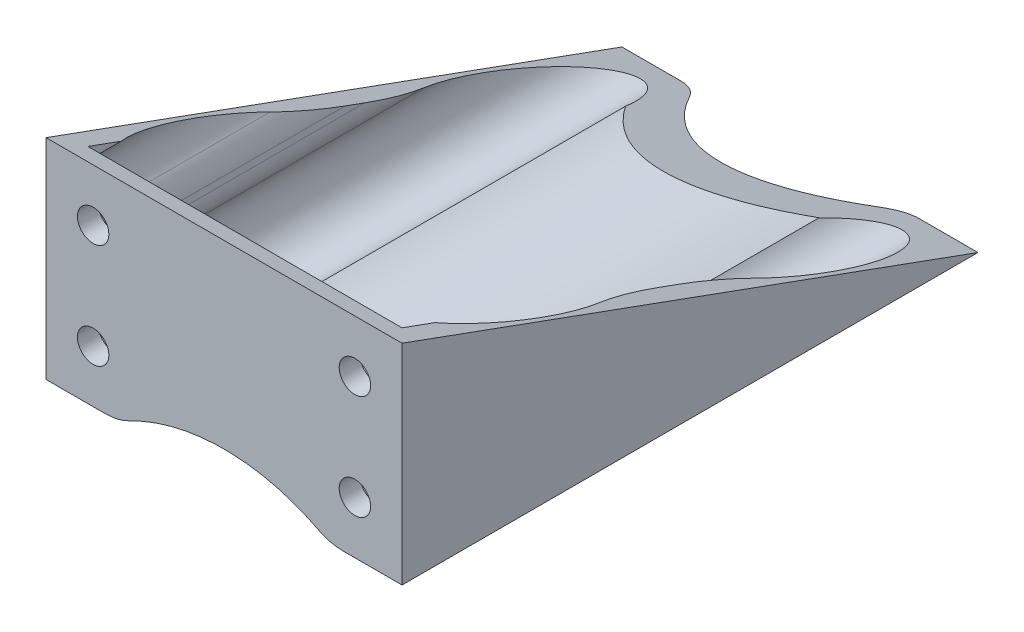
ISO-10303-21;
HEADER;
FILE_DESCRIPTION(('STEP AP214'),'2;1');
FILE_NAME('part.step','',(''),(''),'','','');
FILE_SCHEMA(('AUTOMOTIVE_DESIGN { 1 0 10303 214 1 1 1 1 }'));
ENDSEC;
DATA;
#1=APPLICATION_CONTEXT('core data for automotive mechanical design processes');
#2=APPLICATION_PROTOCOL_DEFINITION('international standard','automotive_design',2000,#1);
#3=PRODUCT_CONTEXT('',#1,'mechanical');
#4=PRODUCT('Part','Part','',(#3));
#5=PRODUCT_RELATED_PRODUCT_CATEGORY('part','',(#4));
#6=PRODUCT_DEFINITION_FORMATION('','',#4);
#7=PRODUCT_DEFINITION_CONTEXT('part definition',#1,'design');
#8=PRODUCT_DEFINITION('design','',#6,#7);
#9=PRODUCT_DEFINITION_SHAPE('','',#8);
#10=(LENGTH_UNIT() NAMED_UNIT(*) SI_UNIT(.MILLI.,.METRE.));
#11=(NAMED_UNIT(*) PLANE_ANGLE_UNIT() SI_UNIT($,.RADIAN.));
#12=(NAMED_UNIT(*) SI_UNIT($,.STERADIAN.) SOLID_ANGLE_UNIT());
#13=UNCERTAINTY_MEASURE_WITH_UNIT(LENGTH_MEASURE(1.E-05),#10,'distance_accuracy_value','');
#14=(GEOMETRIC_REPRESENTATION_CONTEXT(3) GLOBAL_UNCERTAINTY_ASSIGNED_CONTEXT((#13)) GLOBAL_UNIT_ASSIGNED_CONTEXT((#10,
#11,#12)) REPRESENTATION_CONTEXT('',''));
#15=CARTESIAN_POINT('',(0.,0.,0.));
#16=DIRECTION('',(0.,0.,1.));
#17=DIRECTION('',(1.,0.,0.));
#18=AXIS2_PLACEMENT_3D('',#15,#16,#17);
#19=CARTESIAN_POINT('',(32.,0.,0.));
#20=DIRECTION('',(1.,0.,0.));
#21=DIRECTION('',(0.,0.,-1.));
#22=AXIS2_PLACEMENT_3D('',#19,#20,#21);
#23=PLANE('',#22);
#24=DIRECTION('',(0.,0.341743063086704,0.939793423488437));
#25=VECTOR('',#24,1.);
#26=CARTESIAN_POINT('',(32.,0.,-55.));
#27=LINE('',#26,#25);
#28=CARTESIAN_POINT('',(32.,9.66368952654425,-28.4248538020033));
#29=VERTEX_POINT('',#28);
#30=CARTESIAN_POINT('',(32.,10.3363104734556,-26.5751461979971));
#31=VERTEX_POINT('',#30);
#32=EDGE_CURVE('E229',#29,#31,#27,.T.);
#33=ORIENTED_EDGE('',*,*,#32,.F.);
#34=DIRECTION('',(0.,0.,-1.));
#35=VECTOR('',#34,1.);
#36=CARTESIAN_POINT('',(32.,9.66368952654425,-2.));
#37=LINE('',#36,#35);
#38=CARTESIAN_POINT('',(32.,9.66368952654425,-2.));
#39=VERTEX_POINT('',#38);
#40=EDGE_CURVE('E58',#29,#39,#37,.F.);
#41=ORIENTED_EDGE('',*,*,#40,.T.);
#42=DIRECTION('',(0.,-1.,0.));
#43=VECTOR('',#42,1.);
#44=CARTESIAN_POINT('',(32.,20.,-2.));
#45=LINE('',#44,#43);
#46=CARTESIAN_POINT('',(32.,10.3363104734556,-2.));
#47=VERTEX_POINT('',#46);
#48=EDGE_CURVE('E220',#47,#39,#45,.T.);
#49=ORIENTED_EDGE('',*,*,#48,.F.);
#50=DIRECTION('',(0.,0.,-1.));
#51=VECTOR('',#50,1.);
#52=CARTESIAN_POINT('',(32.,10.3363104734556,-22.3368722477978));
#53=LINE('',#52,#51);
#54=EDGE_CURVE('E315',#47,#31,#53,.T.);
#55=ORIENTED_EDGE('',*,*,#54,.T.);
#56=EDGE_LOOP('',(#33,#41,#49,#55));
#57=FACE_BOUND('',#56,.T.);
#58=ADVANCED_FACE('F37',(#57),#23,.F.);
#59=DIRECTION('',(0.,0.,1.));
#60=VECTOR('',#59,1.);
#61=CARTESIAN_POINT('',(32.,18.1224989991992,-55.));
#62=LINE('',#61,#60);
#63=CARTESIAN_POINT('',(32.,18.1224989991992,-2.));
#64=VERTEX_POINT('',#63);
#65=CARTESIAN_POINT('',(32.,18.1224989991992,-5.16312775220221));
#66=VERTEX_POINT('',#65);
#67=EDGE_CURVE('E293',#64,#66,#62,.F.);
#68=ORIENTED_EDGE('',*,*,#67,.F.);
#69=CARTESIAN_POINT('',(32.,19.2727272727273,-2.));
#70=VERTEX_POINT('',#69);
#71=EDGE_CURVE('E217',#70,#64,#45,.T.);
#72=ORIENTED_EDGE('',*,*,#71,.F.);
#73=EDGE_CURVE('E219',#66,#70,#27,.T.);
#74=ORIENTED_EDGE('',*,*,#73,.F.);
#75=EDGE_LOOP('',(#68,#72,#74));
#76=FACE_BOUND('',#75,.T.);
#77=ADVANCED_FACE('F414',(#76),#23,.F.);
#78=CARTESIAN_POINT('',(2.,0.,0.));
#79=DIRECTION('',(1.,0.,0.));
#80=DIRECTION('',(0.,0.,-1.));
#81=AXIS2_PLACEMENT_3D('',#78,#79,#80);
#82=PLANE('',#81);
#83=DIRECTION('',(0.,-1.,0.));
#84=VECTOR('',#83,1.);
#85=CARTESIAN_POINT('',(2.,20.,-2.));
#86=LINE('',#85,#84);
#87=CARTESIAN_POINT('',(2.,10.3363104734556,-2.));
#88=VERTEX_POINT('',#87);
#89=CARTESIAN_POINT('',(2.,9.66368952654456,-2.));
#90=VERTEX_POINT('',#89);
#91=EDGE_CURVE('E204',#88,#90,#86,.T.);
#92=ORIENTED_EDGE('',*,*,#91,.T.);
#93=DIRECTION('',(0.,0.,1.));
#94=VECTOR('',#93,1.);
#95=CARTESIAN_POINT('',(2.,9.66368952654456,0.));
#96=LINE('',#95,#94);
#97=CARTESIAN_POINT('',(2.,9.66368952654456,-28.4248538020024));
#98=VERTEX_POINT('',#97);
#99=EDGE_CURVE('E298',#90,#98,#96,.F.);
#100=ORIENTED_EDGE('',*,*,#99,.T.);
#101=DIRECTION('',(0.,0.341743063086704,0.939793423488437));
#102=VECTOR('',#101,1.);
#103=CARTESIAN_POINT('',(2.,0.,-55.));
#104=LINE('',#103,#102);
#105=CARTESIAN_POINT('',(2.,10.3363104734556,-26.5751461979971));
#106=VERTEX_POINT('',#105);
#107=EDGE_CURVE('E225',#98,#106,#104,.T.);
#108=ORIENTED_EDGE('',*,*,#107,.T.);
#109=DIRECTION('',(0.,0.,1.));
#110=VECTOR('',#109,1.);
#111=CARTESIAN_POINT('',(2.,10.3363104734556,0.));
#112=LINE('',#111,#110);
#113=EDGE_CURVE('E295',#106,#88,#112,.T.);
#114=ORIENTED_EDGE('',*,*,#113,.T.);
#115=EDGE_LOOP('',(#92,#100,#108,#114));
#116=FACE_BOUND('',#115,.T.);
#117=ADVANCED_FACE('F419',(#116),#82,.T.);
#118=CARTESIAN_POINT('',(2.,19.2727272727273,-2.));
#119=VERTEX_POINT('',#118);
#120=CARTESIAN_POINT('',(2.,18.1224989991992,-2.));
#121=VERTEX_POINT('',#120);
#122=EDGE_CURVE('E208',#119,#121,#86,.T.);
#123=ORIENTED_EDGE('',*,*,#122,.T.);
#124=DIRECTION('',(0.,0.,1.));
#125=VECTOR('',#124,1.);
#126=CARTESIAN_POINT('',(2.,18.1224989991992,-55.));
#127=LINE('',#126,#125);
#128=CARTESIAN_POINT('',(2.,18.1224989991992,-5.16312775220218));
#129=VERTEX_POINT('',#128);
#130=EDGE_CURVE('E290',#121,#129,#127,.F.);
#131=ORIENTED_EDGE('',*,*,#130,.T.);
#132=EDGE_CURVE('E223',#129,#119,#104,.T.);
#133=ORIENTED_EDGE('',*,*,#132,.T.);
#134=EDGE_LOOP('',(#123,#131,#133));
#135=FACE_BOUND('',#134,.T.);
#136=ADVANCED_FACE('F426',(#135),#82,.T.);
#137=CARTESIAN_POINT('',(17.,-17.,-55.));
#138=DIRECTION('',(0.,0.,1.));
#139=DIRECTION('',(1.,0.,0.));
#140=AXIS2_PLACEMENT_3D('',#137,#138,#139);
#141=CYLINDRICAL_SURFACE('',#140,21.75);
#142=CARTESIAN_POINT('',(17.,-17.,-2.));
#143=DIRECTION('',(0.,0.,-1.));
#144=DIRECTION('',(-1.,0.,0.));
#145=AXIS2_PLACEMENT_3D('',#142,#143,#144);
#146=CIRCLE('',#145,21.75);
#147=CARTESIAN_POINT('',(26.2319804627916,2.69347700977746,-2.));
#148=VERTEX_POINT('',#147);
#149=CARTESIAN_POINT('',(7.76801953720803,2.6934770097773,-2.));
#150=VERTEX_POINT('',#149);
#151=EDGE_CURVE('E193',#148,#150,#146,.F.);
#152=ORIENTED_EDGE('',*,*,#151,.F.);
#153=DIRECTION('',(0.,0.,1.));
#154=VECTOR('',#153,1.);
#155=CARTESIAN_POINT('',(26.2319804627916,2.69347700977747,-28.5));
#156=LINE('',#155,#154);
#157=CARTESIAN_POINT('',(26.2319804627916,2.69347700977747,-47.592938223112));
#158=VERTEX_POINT('',#157);
#159=EDGE_CURVE('E196',#148,#158,#156,.F.);
#160=ORIENTED_EDGE('',*,*,#159,.T.);
#161=CARTESIAN_POINT('',(17.,-17.,-101.75));
#162=DIRECTION('',(0.,-0.939793423488437,0.341743063086704));
#163=DIRECTION('',(0.,0.341743063086704,0.939793423488437));
#164=AXIS2_PLACEMENT_3D('',#161,#162,#163);
#165=ELLIPSE('',#164,63.644305764538,21.75);
#166=CARTESIAN_POINT('',(7.76801953720805,2.69347700977733,-47.5929382231123));
#167=VERTEX_POINT('',#166);
#168=EDGE_CURVE('E195',#158,#167,#165,.T.);
#169=ORIENTED_EDGE('',*,*,#168,.T.);
#170=DIRECTION('',(0.,0.,1.));
#171=VECTOR('',#170,1.);
#172=CARTESIAN_POINT('',(7.76801953720805,2.69347700977733,-28.5));
#173=LINE('',#172,#171);
#174=EDGE_CURVE('E178',#167,#150,#173,.T.);
#175=ORIENTED_EDGE('',*,*,#174,.T.);
#176=EDGE_LOOP('',(#152,#160,#169,#175));
#177=FACE_BOUND('',#176,.T.);
#178=ADVANCED_FACE('F191',(#177),#141,.T.);
#179=CARTESIAN_POINT('',(34.,0.,-55.));
#180=DIRECTION('',(0.,-0.939793423488437,0.341743063086704));
#181=DIRECTION('',(0.,-0.341743063086704,-0.939793423488437));
#182=AXIS2_PLACEMENT_3D('',#179,#180,#181);
#183=PLANE('',#182);
#184=ORIENTED_EDGE('',*,*,#107,.F.);
#185=CARTESIAN_POINT('',(-2.,9.66368952654456,-28.4248538020025));
#186=DIRECTION('',(0.,-0.939793423488437,0.341743063086704));
#187=DIRECTION('',(0.,0.341743063086704,0.939793423488437));
#188=AXIS2_PLACEMENT_3D('',#185,#186,#187);
#189=ELLIPSE('',#188,11.7046999107196,4.);
#190=CARTESIAN_POINT('',(1.24999999999994,7.33184476327228,-34.8374269010012));
#191=VERTEX_POINT('',#190);
#192=EDGE_CURVE('E307',#98,#191,#189,.F.);
#193=ORIENTED_EDGE('',*,*,#192,.T.);
#194=CARTESIAN_POINT('',(4.49999999999989,5.,-41.25));
#195=DIRECTION('',(0.,-0.939793423488437,0.341743063086704));
#196=DIRECTION('',(0.,0.341743063086704,0.939793423488437));
#197=AXIS2_PLACEMENT_3D('',#194,#195,#196);
#198=ELLIPSE('',#197,11.7046999107196,4.);
#199=EDGE_CURVE('E597',#167,#191,#198,.F.);
#200=ORIENTED_EDGE('',*,*,#199,.F.);
#201=ORIENTED_EDGE('',*,*,#168,.F.);
#202=CARTESIAN_POINT('',(29.4999999999999,5.,-41.25));
#203=DIRECTION('',(0.,-0.939793423488437,0.341743063086704));
#204=DIRECTION('',(0.,0.341743063086704,0.939793423488437));
#205=AXIS2_PLACEMENT_3D('',#202,#203,#204);
#206=ELLIPSE('',#205,11.7046999107196,4.);
#207=CARTESIAN_POINT('',(32.7499999999999,7.33184476327212,-34.8374269010017));
#208=VERTEX_POINT('',#207);
#209=EDGE_CURVE('E337',#208,#158,#206,.F.);
#210=ORIENTED_EDGE('',*,*,#209,.F.);
#211=CARTESIAN_POINT('',(36.,9.66368952654425,-28.4248538020033));
#212=DIRECTION('',(0.,-0.939793423488437,0.341743063086704));
#213=DIRECTION('',(0.,0.341743063086704,0.939793423488437));
#214=AXIS2_PLACEMENT_3D('',#211,#212,#213);
#215=ELLIPSE('',#214,11.7046999107196,4.);
#216=EDGE_CURVE('E303',#208,#29,#215,.F.);
#217=ORIENTED_EDGE('',*,*,#216,.T.);
#218=ORIENTED_EDGE('',*,*,#32,.T.);
#219=CARTESIAN_POINT('',(36.,10.3363104734556,-26.5751461979971));
#220=DIRECTION('',(0.,-0.939793423488437,0.341743063086704));
#221=DIRECTION('',(0.,0.341743063086704,0.939793423488437));
#222=AXIS2_PLACEMENT_3D('',#219,#220,#221);
#223=ELLIPSE('',#222,11.7046999107196,4.);
#224=CARTESIAN_POINT('',(32.75,12.6681552367278,-20.1625730989985));
#225=VERTEX_POINT('',#224);
#226=EDGE_CURVE('E301',#31,#225,#223,.F.);
#227=ORIENTED_EDGE('',*,*,#226,.T.);
#228=CARTESIAN_POINT('',(29.5,15.,-13.75));
#229=DIRECTION('',(0.,-0.939793423488437,0.341743063086704));
#230=DIRECTION('',(0.,0.341743063086704,0.939793423488437));
#231=AXIS2_PLACEMENT_3D('',#228,#229,#230);
#232=ELLIPSE('',#231,11.7046999107196,4.);
#233=EDGE_CURVE('E340',#66,#225,#232,.F.);
#234=ORIENTED_EDGE('',*,*,#233,.F.);
#235=ORIENTED_EDGE('',*,*,#73,.T.);
#236=DIRECTION('',(-1.,0.,0.));
#237=VECTOR('',#236,1.);
#238=CARTESIAN_POINT('',(34.,19.2727272727273,-2.));
#239=LINE('',#238,#237);
#240=EDGE_CURVE('E226',#70,#119,#239,.T.);
#241=ORIENTED_EDGE('',*,*,#240,.T.);
#242=ORIENTED_EDGE('',*,*,#132,.F.);
#243=CARTESIAN_POINT('',(4.49999999999999,15.,-13.75));
#244=DIRECTION('',(0.,-0.939793423488437,0.341743063086704));
#245=DIRECTION('',(0.,0.341743063086704,0.939793423488437));
#246=AXIS2_PLACEMENT_3D('',#243,#244,#245);
#247=ELLIPSE('',#246,11.7046999107196,4.);
#248=CARTESIAN_POINT('',(1.25,12.6681552367278,-20.1625730989986));
#249=VERTEX_POINT('',#248);
#250=EDGE_CURVE('E346',#249,#129,#247,.F.);
#251=ORIENTED_EDGE('',*,*,#250,.F.);
#252=CARTESIAN_POINT('',(-2.,10.3363104734556,-26.5751461979971));
#253=DIRECTION('',(0.,-0.939793423488437,0.341743063086704));
#254=DIRECTION('',(0.,0.341743063086704,0.939793423488437));
#255=AXIS2_PLACEMENT_3D('',#252,#253,#254);
#256=ELLIPSE('',#255,11.7046999107196,4.);
#257=EDGE_CURVE('E305',#249,#106,#256,.F.);
#258=ORIENTED_EDGE('',*,*,#257,.T.);
#259=EDGE_LOOP('',(#184,#193,#200,#201,#210,#217,#218,#227,#234,#235,#241,#242,#251,#258));
#260=FACE_BOUND('',#259,.T.);
#261=CARTESIAN_POINT('',(17.,-17.,-101.75));
#262=DIRECTION('',(0.,-0.939793423488437,0.341743063086704));
#263=DIRECTION('',(0.,0.341743063086704,0.939793423488437));
#264=AXIS2_PLACEMENT_3D('',#261,#262,#263);
#265=ELLIPSE('',#264,57.7919558091781,19.75);
#266=CARTESIAN_POINT('',(26.0479262339943,0.555555555555552,-53.4722222222222));
#267=VERTEX_POINT('',#266);
#268=CARTESIAN_POINT('',(7.95207376600571,0.555555555555556,-53.4722222222222));
#269=VERTEX_POINT('',#268);
#270=EDGE_CURVE('E261',#267,#269,#265,.T.);
#271=ORIENTED_EDGE('',*,*,#270,.T.);
#272=CARTESIAN_POINT('',(5.66145952955145,5.,-41.25));
#273=DIRECTION('',(0.,-0.939793423488437,0.341743063086704));
#274=DIRECTION('',(0.,0.341743063086704,0.939793423488437));
#275=AXIS2_PLACEMENT_3D('',#272,#273,#274);
#276=ELLIPSE('',#275,14.6308748883995,5.);
#277=CARTESIAN_POINT('',(5.66145952955145,0.,-55.));
#278=VERTEX_POINT('',#277);
#279=EDGE_CURVE('E285',#269,#278,#276,.F.);
#280=ORIENTED_EDGE('',*,*,#279,.T.);
#281=DIRECTION('',(-1.,0.,0.));
#282=VECTOR('',#281,1.);
#283=CARTESIAN_POINT('',(34.,0.,-55.));
#284=LINE('',#283,#282);
#285=CARTESIAN_POINT('',(0.,0.,-55.));
#286=VERTEX_POINT('',#285);
#287=EDGE_CURVE('E253',#278,#286,#284,.T.);
#288=ORIENTED_EDGE('',*,*,#287,.T.);
#289=DIRECTION('',(0.,0.341743063086704,0.939793423488437));
#290=VECTOR('',#289,1.);
#291=CARTESIAN_POINT('',(0.,0.,-55.));
#292=LINE('',#291,#290);
#293=CARTESIAN_POINT('',(0.,20.,0.));
#294=VERTEX_POINT('',#293);
#295=EDGE_CURVE('E240',#286,#294,#292,.T.);
#296=ORIENTED_EDGE('',*,*,#295,.T.);
#297=DIRECTION('',(-1.,0.,0.));
#298=VECTOR('',#297,1.);
#299=CARTESIAN_POINT('',(34.,20.,0.));
#300=LINE('',#299,#298);
#301=CARTESIAN_POINT('',(34.,20.,0.));
#302=VERTEX_POINT('',#301);
#303=EDGE_CURVE('E244',#302,#294,#300,.T.);
#304=ORIENTED_EDGE('',*,*,#303,.F.);
#305=DIRECTION('',(0.,0.341743063086704,0.939793423488437));
#306=VECTOR('',#305,1.);
#307=CARTESIAN_POINT('',(34.,0.,-55.));
#308=LINE('',#307,#306);
#309=CARTESIAN_POINT('',(34.,0.,-55.));
#310=VERTEX_POINT('',#309);
#311=EDGE_CURVE('E242',#310,#302,#308,.T.);
#312=ORIENTED_EDGE('',*,*,#311,.F.);
#313=CARTESIAN_POINT('',(28.3385404704486,0.,-55.));
#314=VERTEX_POINT('',#313);
#315=EDGE_CURVE('E254',#310,#314,#284,.T.);
#316=ORIENTED_EDGE('',*,*,#315,.T.);
#317=CARTESIAN_POINT('',(28.3385404704486,5.,-41.25));
#318=DIRECTION('',(0.,-0.939793423488437,0.341743063086704));
#319=DIRECTION('',(0.,0.341743063086704,0.939793423488437));
#320=AXIS2_PLACEMENT_3D('',#317,#318,#319);
#321=ELLIPSE('',#320,14.6308748883995,5.);
#322=EDGE_CURVE('E283',#314,#267,#321,.F.);
#323=ORIENTED_EDGE('',*,*,#322,.T.);
#324=EDGE_LOOP('',(#271,#280,#288,#296,#304,#312,#316,#323));
#325=FACE_BOUND('',#324,.T.);
#326=ADVANCED_FACE('F334',(#260,#325),#183,.F.);
#327=CARTESIAN_POINT('',(34.,0.,0.));
#328=DIRECTION('',(0.,1.,0.));
#329=DIRECTION('',(0.,0.,1.));
#330=AXIS2_PLACEMENT_3D('',#327,#328,#329);
#331=PLANE('',#330);
#332=ORIENTED_EDGE('',*,*,#287,.F.);
#333=DIRECTION('',(0.,0.,1.));
#334=VECTOR('',#333,1.);
#335=CARTESIAN_POINT('',(5.66145952955145,0.,0.));
#336=LINE('',#335,#334);
#337=CARTESIAN_POINT('',(5.66145952955145,0.,0.));
#338=VERTEX_POINT('',#337);
#339=EDGE_CURVE('E264',#278,#338,#336,.T.);
#340=ORIENTED_EDGE('',*,*,#339,.T.);
#341=DIRECTION('',(-1.,0.,0.));
#342=VECTOR('',#341,1.);
#343=CARTESIAN_POINT('',(34.,0.,0.));
#344=LINE('',#343,#342);
#345=CARTESIAN_POINT('',(0.,0.,0.));
#346=VERTEX_POINT('',#345);
#347=EDGE_CURVE('E257',#338,#346,#344,.T.);
#348=ORIENTED_EDGE('',*,*,#347,.T.);
#349=DIRECTION('',(0.,0.,-1.));
#350=VECTOR('',#349,1.);
#351=CARTESIAN_POINT('',(0.,0.,0.));
#352=LINE('',#351,#350);
#353=EDGE_CURVE('E247',#346,#286,#352,.T.);
#354=ORIENTED_EDGE('',*,*,#353,.T.);
#355=EDGE_LOOP('',(#332,#340,#348,#354));
#356=FACE_BOUND('',#355,.T.);
#357=ADVANCED_FACE('F365',(#356),#331,.F.);
#358=CARTESIAN_POINT('',(34.,20.,0.));
#359=DIRECTION('',(0.,0.,-1.));
#360=DIRECTION('',(-1.,0.,0.));
#361=AXIS2_PLACEMENT_3D('',#358,#359,#360);
#362=PLANE('',#361);
#363=CARTESIAN_POINT('',(4.5000000000001,5.,0.));
#364=DIRECTION('',(0.,0.,1.));
#365=DIRECTION('',(1.,0.,0.));
#366=AXIS2_PLACEMENT_3D('',#363,#364,#365);
#367=CIRCLE('',#366,1.5);
#368=CARTESIAN_POINT('',(6.0000000000001,5.,0.));
#369=VERTEX_POINT('',#368);
#370=EDGE_CURVE('E345',#369,#369,#367,.T.);
#371=ORIENTED_EDGE('',*,*,#370,.F.);
#372=EDGE_LOOP('',(#371));
#373=FACE_BOUND('',#372,.T.);
#374=CARTESIAN_POINT('',(29.5000000000001,5.,0.));
#375=DIRECTION('',(0.,0.,1.));
#376=DIRECTION('',(1.,0.,0.));
#377=AXIS2_PLACEMENT_3D('',#374,#375,#376);
#378=CIRCLE('',#377,1.5);
#379=CARTESIAN_POINT('',(31.0000000000001,5.,0.));
#380=VERTEX_POINT('',#379);
#381=EDGE_CURVE('E349',#380,#380,#378,.T.);
#382=ORIENTED_EDGE('',*,*,#381,.F.);
#383=EDGE_LOOP('',(#382));
#384=FACE_BOUND('',#383,.T.);
#385=CARTESIAN_POINT('',(29.5,15.,0.));
#386=DIRECTION('',(0.,0.,1.));
#387=DIRECTION('',(1.,0.,0.));
#388=AXIS2_PLACEMENT_3D('',#385,#386,#387);
#389=CIRCLE('',#388,1.5);
#390=CARTESIAN_POINT('',(31.,15.,0.));
#391=VERTEX_POINT('',#390);
#392=EDGE_CURVE('E353',#391,#391,#389,.T.);
#393=ORIENTED_EDGE('',*,*,#392,.F.);
#394=EDGE_LOOP('',(#393));
#395=FACE_BOUND('',#394,.T.);
#396=CARTESIAN_POINT('',(4.49999999999999,15.,0.));
#397=DIRECTION('',(0.,0.,1.));
#398=DIRECTION('',(1.,0.,0.));
#399=AXIS2_PLACEMENT_3D('',#396,#397,#398);
#400=CIRCLE('',#399,1.5);
#401=CARTESIAN_POINT('',(5.99999999999999,15.,0.));
#402=VERTEX_POINT('',#401);
#403=EDGE_CURVE('E215',#402,#402,#400,.T.);
#404=ORIENTED_EDGE('',*,*,#403,.F.);
#405=EDGE_LOOP('',(#404));
#406=FACE_BOUND('',#405,.T.);
#407=ORIENTED_EDGE('',*,*,#347,.F.);
#408=CARTESIAN_POINT('',(5.66145952955145,5.,0.));
#409=DIRECTION('',(0.,0.,-1.));
#410=DIRECTION('',(-1.,0.,0.));
#411=AXIS2_PLACEMENT_3D('',#408,#409,#410);
#412=CIRCLE('',#411,5.);
#413=CARTESIAN_POINT('',(7.9520737660057,0.555555555555556,0.));
#414=VERTEX_POINT('',#413);
#415=EDGE_CURVE('E277',#338,#414,#412,.F.);
#416=ORIENTED_EDGE('',*,*,#415,.T.);
#417=CARTESIAN_POINT('',(17.,-17.,0.));
#418=DIRECTION('',(0.,0.,1.));
#419=DIRECTION('',(1.,0.,0.));
#420=AXIS2_PLACEMENT_3D('',#417,#418,#419);
#421=CIRCLE('',#420,19.75);
#422=CARTESIAN_POINT('',(26.0479262339943,0.555555555555556,0.));
#423=VERTEX_POINT('',#422);
#424=EDGE_CURVE('E232',#423,#414,#421,.T.);
#425=ORIENTED_EDGE('',*,*,#424,.F.);
#426=CARTESIAN_POINT('',(28.3385404704486,5.,0.));
#427=DIRECTION('',(0.,0.,-1.));
#428=DIRECTION('',(-1.,0.,0.));
#429=AXIS2_PLACEMENT_3D('',#426,#427,#428);
#430=CIRCLE('',#429,5.);
#431=CARTESIAN_POINT('',(28.3385404704486,0.,0.));
#432=VERTEX_POINT('',#431);
#433=EDGE_CURVE('E275',#423,#432,#430,.F.);
#434=ORIENTED_EDGE('',*,*,#433,.T.);
#435=CARTESIAN_POINT('',(34.,0.,0.));
#436=VERTEX_POINT('',#435);
#437=EDGE_CURVE('E258',#436,#432,#344,.T.);
#438=ORIENTED_EDGE('',*,*,#437,.F.);
#439=DIRECTION('',(0.,-1.,0.));
#440=VECTOR('',#439,1.);
#441=CARTESIAN_POINT('',(34.,20.,0.));
#442=LINE('',#441,#440);
#443=EDGE_CURVE('E236',#302,#436,#442,.T.);
#444=ORIENTED_EDGE('',*,*,#443,.F.);
#445=ORIENTED_EDGE('',*,*,#303,.T.);
#446=DIRECTION('',(0.,-1.,0.));
#447=VECTOR('',#446,1.);
#448=CARTESIAN_POINT('',(0.,20.,0.));
#449=LINE('',#448,#447);
#450=EDGE_CURVE('E235',#294,#346,#449,.T.);
#451=ORIENTED_EDGE('',*,*,#450,.T.);
#452=EDGE_LOOP('',(#407,#416,#425,#434,#438,#444,#445,#451));
#453=FACE_BOUND('',#452,.T.);
#454=ADVANCED_FACE('F361',(#373,#384,#395,#406,#453),#362,.F.);
#455=ORIENTED_EDGE('',*,*,#437,.T.);
#456=DIRECTION('',(0.,0.,1.));
#457=VECTOR('',#456,1.);
#458=CARTESIAN_POINT('',(28.3385404704486,0.,0.));
#459=LINE('',#458,#457);
#460=EDGE_CURVE('E197',#432,#314,#459,.F.);
#461=ORIENTED_EDGE('',*,*,#460,.T.);
#462=ORIENTED_EDGE('',*,*,#315,.F.);
#463=DIRECTION('',(0.,0.,-1.));
#464=VECTOR('',#463,1.);
#465=CARTESIAN_POINT('',(34.,0.,0.));
#466=LINE('',#465,#464);
#467=EDGE_CURVE('E239',#436,#310,#466,.T.);
#468=ORIENTED_EDGE('',*,*,#467,.F.);
#469=EDGE_LOOP('',(#455,#461,#462,#468));
#470=FACE_BOUND('',#469,.T.);
#471=ADVANCED_FACE('F364',(#470),#331,.F.);
#472=CARTESIAN_POINT('',(34.,0.,0.));
#473=DIRECTION('',(1.,0.,0.));
#474=DIRECTION('',(0.,0.,-1.));
#475=AXIS2_PLACEMENT_3D('',#472,#473,#474);
#476=PLANE('',#475);
#477=ORIENTED_EDGE('',*,*,#443,.T.);
#478=ORIENTED_EDGE('',*,*,#467,.T.);
#479=ORIENTED_EDGE('',*,*,#311,.T.);
#480=EDGE_LOOP('',(#477,#478,#479));
#481=FACE_BOUND('',#480,.T.);
#482=ADVANCED_FACE('F388',(#481),#476,.T.);
#483=CARTESIAN_POINT('',(0.,0.,0.));
#484=DIRECTION('',(1.,0.,0.));
#485=DIRECTION('',(0.,0.,-1.));
#486=AXIS2_PLACEMENT_3D('',#483,#484,#485);
#487=PLANE('',#486);
#488=ORIENTED_EDGE('',*,*,#450,.F.);
#489=ORIENTED_EDGE('',*,*,#295,.F.);
#490=ORIENTED_EDGE('',*,*,#353,.F.);
#491=EDGE_LOOP('',(#488,#489,#490));
#492=FACE_BOUND('',#491,.T.);
#493=ADVANCED_FACE('F382',(#492),#487,.F.);
#494=CARTESIAN_POINT('',(17.,-17.,-55.));
#495=DIRECTION('',(0.,0.,1.));
#496=DIRECTION('',(1.,0.,0.));
#497=AXIS2_PLACEMENT_3D('',#494,#495,#496);
#498=CYLINDRICAL_SURFACE('',#497,19.75);
#499=ORIENTED_EDGE('',*,*,#424,.T.);
#500=DIRECTION('',(0.,0.,1.));
#501=VECTOR('',#500,1.);
#502=CARTESIAN_POINT('',(7.9520737660057,0.555555555555559,-55.));
#503=LINE('',#502,#501);
#504=EDGE_CURVE('E281',#414,#269,#503,.F.);
#505=ORIENTED_EDGE('',*,*,#504,.T.);
#506=ORIENTED_EDGE('',*,*,#270,.F.);
#507=DIRECTION('',(0.,0.,1.));
#508=VECTOR('',#507,1.);
#509=CARTESIAN_POINT('',(26.0479262339943,0.555555555555559,-55.));
#510=LINE('',#509,#508);
#511=EDGE_CURVE('E279',#267,#423,#510,.T.);
#512=ORIENTED_EDGE('',*,*,#511,.T.);
#513=EDGE_LOOP('',(#499,#505,#506,#512));
#514=FACE_BOUND('',#513,.T.);
#515=ADVANCED_FACE('F398',(#514),#498,.F.);
#516=CARTESIAN_POINT('',(34.,20.,-2.));
#517=DIRECTION('',(0.,0.,-1.));
#518=DIRECTION('',(-1.,0.,0.));
#519=AXIS2_PLACEMENT_3D('',#516,#517,#518);
#520=PLANE('',#519);
#521=CARTESIAN_POINT('',(29.5,15.,-2.));
#522=DIRECTION('',(0.,0.,-1.));
#523=DIRECTION('',(-1.,0.,0.));
#524=AXIS2_PLACEMENT_3D('',#521,#522,#523);
#525=CIRCLE('',#524,4.);
#526=CARTESIAN_POINT('',(32.75,12.6681552367278,-2.));
#527=VERTEX_POINT('',#526);
#528=EDGE_CURVE('E598',#64,#527,#525,.T.);
#529=ORIENTED_EDGE('',*,*,#528,.T.);
#530=CARTESIAN_POINT('',(36.,10.3363104734556,-2.));
#531=DIRECTION('',(0.,0.,-1.));
#532=DIRECTION('',(-1.,0.,0.));
#533=AXIS2_PLACEMENT_3D('',#530,#531,#532);
#534=CIRCLE('',#533,4.);
#535=EDGE_CURVE('E11',#527,#47,#534,.F.);
#536=ORIENTED_EDGE('',*,*,#535,.T.);
#537=ORIENTED_EDGE('',*,*,#48,.T.);
#538=CARTESIAN_POINT('',(36.,9.66368952654425,-2.));
#539=DIRECTION('',(0.,0.,-1.));
#540=DIRECTION('',(-1.,0.,0.));
#541=AXIS2_PLACEMENT_3D('',#538,#539,#540);
#542=CIRCLE('',#541,4.);
#543=CARTESIAN_POINT('',(32.7499999999999,7.33184476327213,-2.));
#544=VERTEX_POINT('',#543);
#545=EDGE_CURVE('E45',#39,#544,#542,.F.);
#546=ORIENTED_EDGE('',*,*,#545,.T.);
#547=CARTESIAN_POINT('',(29.4999999999999,5.,-2.));
#548=DIRECTION('',(0.,0.,-1.));
#549=DIRECTION('',(-1.,0.,0.));
#550=AXIS2_PLACEMENT_3D('',#547,#548,#549);
#551=CIRCLE('',#550,4.);
#552=EDGE_CURVE('E186',#544,#148,#551,.T.);
#553=ORIENTED_EDGE('',*,*,#552,.T.);
#554=ORIENTED_EDGE('',*,*,#151,.T.);
#555=CARTESIAN_POINT('',(4.49999999999989,5.,-2.));
#556=DIRECTION('',(0.,0.,-1.));
#557=DIRECTION('',(-1.,0.,0.));
#558=AXIS2_PLACEMENT_3D('',#555,#556,#557);
#559=CIRCLE('',#558,4.);
#560=CARTESIAN_POINT('',(1.24999999999994,7.33184476327228,-2.));
#561=VERTEX_POINT('',#560);
#562=EDGE_CURVE('E174',#150,#561,#559,.T.);
#563=ORIENTED_EDGE('',*,*,#562,.T.);
#564=CARTESIAN_POINT('',(-2.,9.66368952654456,-2.));
#565=DIRECTION('',(0.,0.,-1.));
#566=DIRECTION('',(-1.,0.,0.));
#567=AXIS2_PLACEMENT_3D('',#564,#565,#566);
#568=CIRCLE('',#567,4.);
#569=EDGE_CURVE('E320',#561,#90,#568,.F.);
#570=ORIENTED_EDGE('',*,*,#569,.T.);
#571=ORIENTED_EDGE('',*,*,#91,.F.);
#572=CARTESIAN_POINT('',(-2.,10.3363104734556,-2.));
#573=DIRECTION('',(0.,0.,-1.));
#574=DIRECTION('',(-1.,0.,0.));
#575=AXIS2_PLACEMENT_3D('',#572,#573,#574);
#576=CIRCLE('',#575,4.);
#577=CARTESIAN_POINT('',(1.25,12.6681552367278,-2.));
#578=VERTEX_POINT('',#577);
#579=EDGE_CURVE('E322',#88,#578,#576,.F.);
#580=ORIENTED_EDGE('',*,*,#579,.T.);
#581=CARTESIAN_POINT('',(4.49999999999999,15.,-2.));
#582=DIRECTION('',(0.,0.,-1.));
#583=DIRECTION('',(-1.,0.,0.));
#584=AXIS2_PLACEMENT_3D('',#581,#582,#583);
#585=CIRCLE('',#584,4.);
#586=EDGE_CURVE('E185',#578,#121,#585,.T.);
#587=ORIENTED_EDGE('',*,*,#586,.T.);
#588=ORIENTED_EDGE('',*,*,#122,.F.);
#589=ORIENTED_EDGE('',*,*,#240,.F.);
#590=ORIENTED_EDGE('',*,*,#71,.T.);
#591=EDGE_LOOP('',(#529,#536,#537,#546,#553,#554,#563,#570,#571,#580,#587,#588,#589,#590));
#592=FACE_BOUND('',#591,.T.);
#593=CARTESIAN_POINT('',(29.5,15.,-2.));
#594=DIRECTION('',(0.,0.,-1.));
#595=DIRECTION('',(-1.,0.,0.));
#596=AXIS2_PLACEMENT_3D('',#593,#594,#595);
#597=CIRCLE('',#596,1.5);
#598=CARTESIAN_POINT('',(28.,15.,-2.));
#599=VERTEX_POINT('',#598);
#600=EDGE_CURVE('E268',#599,#599,#597,.T.);
#601=ORIENTED_EDGE('',*,*,#600,.F.);
#602=EDGE_LOOP('',(#601));
#603=FACE_BOUND('',#602,.T.);
#604=CARTESIAN_POINT('',(4.49999999999999,15.,-2.));
#605=DIRECTION('',(0.,0.,-1.));
#606=DIRECTION('',(-1.,0.,0.));
#607=AXIS2_PLACEMENT_3D('',#604,#605,#606);
#608=CIRCLE('',#607,1.5);
#609=CARTESIAN_POINT('',(2.99999999999999,15.,-2.));
#610=VERTEX_POINT('',#609);
#611=EDGE_CURVE('E265',#610,#610,#608,.T.);
#612=ORIENTED_EDGE('',*,*,#611,.F.);
#613=EDGE_LOOP('',(#612));
#614=FACE_BOUND('',#613,.T.);
#615=CARTESIAN_POINT('',(4.5000000000001,5.,-2.));
#616=DIRECTION('',(0.,0.,-1.));
#617=DIRECTION('',(-1.,0.,0.));
#618=AXIS2_PLACEMENT_3D('',#615,#616,#617);
#619=CIRCLE('',#618,1.5);
#620=CARTESIAN_POINT('',(3.0000000000001,5.,-2.));
#621=VERTEX_POINT('',#620);
#622=EDGE_CURVE('E205',#621,#621,#619,.T.);
#623=ORIENTED_EDGE('',*,*,#622,.F.);
#624=EDGE_LOOP('',(#623));
#625=FACE_BOUND('',#624,.T.);
#626=CARTESIAN_POINT('',(29.5000000000001,5.,-2.));
#627=DIRECTION('',(0.,0.,-1.));
#628=DIRECTION('',(-1.,0.,0.));
#629=AXIS2_PLACEMENT_3D('',#626,#627,#628);
#630=CIRCLE('',#629,1.5);
#631=CARTESIAN_POINT('',(28.0000000000001,5.,-2.));
#632=VERTEX_POINT('',#631);
#633=EDGE_CURVE('E211',#632,#632,#630,.T.);
#634=ORIENTED_EDGE('',*,*,#633,.F.);
#635=EDGE_LOOP('',(#634));
#636=FACE_BOUND('',#635,.T.);
#637=ADVANCED_FACE('F200',(#592,#603,#614,#625,#636),#520,.T.);
#638=CARTESIAN_POINT('',(4.49999999999999,15.,-10.));
#639=DIRECTION('',(0.,0.,1.));
#640=DIRECTION('',(1.,0.,0.));
#641=AXIS2_PLACEMENT_3D('',#638,#639,#640);
#642=CYLINDRICAL_SURFACE('',#641,1.5);
#643=ORIENTED_EDGE('',*,*,#611,.T.);
#644=EDGE_LOOP('',(#643));
#645=FACE_BOUND('',#644,.T.);
#646=ORIENTED_EDGE('',*,*,#403,.T.);
#647=EDGE_LOOP('',(#646));
#648=FACE_BOUND('',#647,.T.);
#649=ADVANCED_FACE('F518',(#645,#648),#642,.F.);
#650=CARTESIAN_POINT('',(29.5,15.,-10.));
#651=DIRECTION('',(0.,0.,1.));
#652=DIRECTION('',(1.,0.,0.));
#653=AXIS2_PLACEMENT_3D('',#650,#651,#652);
#654=CYLINDRICAL_SURFACE('',#653,1.5);
#655=ORIENTED_EDGE('',*,*,#600,.T.);
#656=EDGE_LOOP('',(#655));
#657=FACE_BOUND('',#656,.T.);
#658=ORIENTED_EDGE('',*,*,#392,.T.);
#659=EDGE_LOOP('',(#658));
#660=FACE_BOUND('',#659,.T.);
#661=ADVANCED_FACE('F608',(#657,#660),#654,.F.);
#662=CARTESIAN_POINT('',(29.5000000000001,5.,-10.));
#663=DIRECTION('',(0.,0.,1.));
#664=DIRECTION('',(1.,0.,0.));
#665=AXIS2_PLACEMENT_3D('',#662,#663,#664);
#666=CYLINDRICAL_SURFACE('',#665,1.5);
#667=ORIENTED_EDGE('',*,*,#633,.T.);
#668=EDGE_LOOP('',(#667));
#669=FACE_BOUND('',#668,.T.);
#670=ORIENTED_EDGE('',*,*,#381,.T.);
#671=EDGE_LOOP('',(#670));
#672=FACE_BOUND('',#671,.T.);
#673=ADVANCED_FACE('F359',(#669,#672),#666,.F.);
#674=CARTESIAN_POINT('',(4.5000000000001,5.,-10.));
#675=DIRECTION('',(0.,0.,1.));
#676=DIRECTION('',(1.,0.,0.));
#677=AXIS2_PLACEMENT_3D('',#674,#675,#676);
#678=CYLINDRICAL_SURFACE('',#677,1.5);
#679=ORIENTED_EDGE('',*,*,#622,.T.);
#680=EDGE_LOOP('',(#679));
#681=FACE_BOUND('',#680,.T.);
#682=ORIENTED_EDGE('',*,*,#370,.T.);
#683=EDGE_LOOP('',(#682));
#684=FACE_BOUND('',#683,.T.);
#685=ADVANCED_FACE('F404',(#681,#684),#678,.F.);
#686=CARTESIAN_POINT('',(5.66145952955145,5.,-55.));
#687=DIRECTION('',(0.,0.,1.));
#688=DIRECTION('',(1.,0.,0.));
#689=AXIS2_PLACEMENT_3D('',#686,#687,#688);
#690=CYLINDRICAL_SURFACE('',#689,5.);
#691=ORIENTED_EDGE('',*,*,#279,.F.);
#692=ORIENTED_EDGE('',*,*,#504,.F.);
#693=ORIENTED_EDGE('',*,*,#415,.F.);
#694=ORIENTED_EDGE('',*,*,#339,.F.);
#695=EDGE_LOOP('',(#691,#692,#693,#694));
#696=FACE_BOUND('',#695,.T.);
#697=ADVANCED_FACE('F402',(#696),#690,.T.);
#698=CARTESIAN_POINT('',(28.3385404704486,5.,-55.));
#699=DIRECTION('',(0.,0.,1.));
#700=DIRECTION('',(1.,0.,0.));
#701=AXIS2_PLACEMENT_3D('',#698,#699,#700);
#702=CYLINDRICAL_SURFACE('',#701,5.);
#703=ORIENTED_EDGE('',*,*,#433,.F.);
#704=ORIENTED_EDGE('',*,*,#511,.F.);
#705=ORIENTED_EDGE('',*,*,#322,.F.);
#706=ORIENTED_EDGE('',*,*,#460,.F.);
#707=EDGE_LOOP('',(#703,#704,#705,#706));
#708=FACE_BOUND('',#707,.T.);
#709=ADVANCED_FACE('F395',(#708),#702,.T.);
#710=CARTESIAN_POINT('',(4.49999999999989,5.,-55.));
#711=DIRECTION('',(0.,0.,1.));
#712=DIRECTION('',(1.,0.,0.));
#713=AXIS2_PLACEMENT_3D('',#710,#711,#712);
#714=CYLINDRICAL_SURFACE('',#713,4.);
#715=ORIENTED_EDGE('',*,*,#199,.T.);
#716=DIRECTION('',(0.,0.,1.));
#717=VECTOR('',#716,1.);
#718=CARTESIAN_POINT('',(1.24999999999994,7.33184476327228,-55.));
#719=LINE('',#718,#717);
#720=EDGE_CURVE('E181',#191,#561,#719,.T.);
#721=ORIENTED_EDGE('',*,*,#720,.T.);
#722=ORIENTED_EDGE('',*,*,#562,.F.);
#723=ORIENTED_EDGE('',*,*,#174,.F.);
#724=EDGE_LOOP('',(#715,#721,#722,#723));
#725=FACE_BOUND('',#724,.T.);
#726=ADVANCED_FACE('F177',(#725),#714,.F.);
#727=CARTESIAN_POINT('',(29.4999999999999,5.,-55.));
#728=DIRECTION('',(0.,0.,1.));
#729=DIRECTION('',(1.,0.,0.));
#730=AXIS2_PLACEMENT_3D('',#727,#728,#729);
#731=CYLINDRICAL_SURFACE('',#730,4.);
#732=ORIENTED_EDGE('',*,*,#552,.F.);
#733=DIRECTION('',(0.,0.,1.));
#734=VECTOR('',#733,1.);
#735=CARTESIAN_POINT('',(32.7499999999999,7.33184476327212,-55.));
#736=LINE('',#735,#734);
#737=EDGE_CURVE('E312',#544,#208,#736,.F.);
#738=ORIENTED_EDGE('',*,*,#737,.T.);
#739=ORIENTED_EDGE('',*,*,#209,.T.);
#740=ORIENTED_EDGE('',*,*,#159,.F.);
#741=EDGE_LOOP('',(#732,#738,#739,#740));
#742=FACE_BOUND('',#741,.T.);
#743=ADVANCED_FACE('F327',(#742),#731,.F.);
#744=CARTESIAN_POINT('',(4.49999999999999,15.,-55.));
#745=DIRECTION('',(0.,0.,1.));
#746=DIRECTION('',(1.,0.,0.));
#747=AXIS2_PLACEMENT_3D('',#744,#745,#746);
#748=CYLINDRICAL_SURFACE('',#747,4.);
#749=ORIENTED_EDGE('',*,*,#586,.F.);
#750=DIRECTION('',(0.,0.,1.));
#751=VECTOR('',#750,1.);
#752=CARTESIAN_POINT('',(1.25,12.6681552367278,-55.));
#753=LINE('',#752,#751);
#754=EDGE_CURVE('E310',#578,#249,#753,.F.);
#755=ORIENTED_EDGE('',*,*,#754,.T.);
#756=ORIENTED_EDGE('',*,*,#250,.T.);
#757=ORIENTED_EDGE('',*,*,#130,.F.);
#758=EDGE_LOOP('',(#749,#755,#756,#757));
#759=FACE_BOUND('',#758,.T.);
#760=ADVANCED_FACE('F534',(#759),#748,.F.);
#761=CARTESIAN_POINT('',(29.5,15.,-55.));
#762=DIRECTION('',(0.,0.,1.));
#763=DIRECTION('',(1.,0.,0.));
#764=AXIS2_PLACEMENT_3D('',#761,#762,#763);
#765=CYLINDRICAL_SURFACE('',#764,4.);
#766=ORIENTED_EDGE('',*,*,#233,.T.);
#767=DIRECTION('',(0.,0.,1.));
#768=VECTOR('',#767,1.);
#769=CARTESIAN_POINT('',(32.75,12.6681552367278,-55.));
#770=LINE('',#769,#768);
#771=EDGE_CURVE('E318',#225,#527,#770,.T.);
#772=ORIENTED_EDGE('',*,*,#771,.T.);
#773=ORIENTED_EDGE('',*,*,#528,.F.);
#774=ORIENTED_EDGE('',*,*,#67,.T.);
#775=EDGE_LOOP('',(#766,#772,#773,#774));
#776=FACE_BOUND('',#775,.T.);
#777=ADVANCED_FACE('F343',(#776),#765,.F.);
#778=CARTESIAN_POINT('',(-2.,9.66368952654456,-55.));
#779=DIRECTION('',(0.,0.,1.));
#780=DIRECTION('',(1.,0.,0.));
#781=AXIS2_PLACEMENT_3D('',#778,#779,#780);
#782=CYLINDRICAL_SURFACE('',#781,4.);
#783=ORIENTED_EDGE('',*,*,#569,.F.);
#784=ORIENTED_EDGE('',*,*,#720,.F.);
#785=ORIENTED_EDGE('',*,*,#192,.F.);
#786=ORIENTED_EDGE('',*,*,#99,.F.);
#787=EDGE_LOOP('',(#783,#784,#785,#786));
#788=FACE_BOUND('',#787,.T.);
#789=ADVANCED_FACE('F552',(#788),#782,.T.);
#790=CARTESIAN_POINT('',(-2.,10.3363104734556,-55.));
#791=DIRECTION('',(0.,0.,1.));
#792=DIRECTION('',(1.,0.,0.));
#793=AXIS2_PLACEMENT_3D('',#790,#791,#792);
#794=CYLINDRICAL_SURFACE('',#793,4.);
#795=ORIENTED_EDGE('',*,*,#257,.F.);
#796=ORIENTED_EDGE('',*,*,#754,.F.);
#797=ORIENTED_EDGE('',*,*,#579,.F.);
#798=ORIENTED_EDGE('',*,*,#113,.F.);
#799=EDGE_LOOP('',(#795,#796,#797,#798));
#800=FACE_BOUND('',#799,.T.);
#801=ADVANCED_FACE('F561',(#800),#794,.T.);
#802=CARTESIAN_POINT('',(36.,9.66368952654425,-55.));
#803=DIRECTION('',(0.,0.,1.));
#804=DIRECTION('',(1.,0.,0.));
#805=AXIS2_PLACEMENT_3D('',#802,#803,#804);
#806=CYLINDRICAL_SURFACE('',#805,4.);
#807=ORIENTED_EDGE('',*,*,#545,.F.);
#808=ORIENTED_EDGE('',*,*,#40,.F.);
#809=ORIENTED_EDGE('',*,*,#216,.F.);
#810=ORIENTED_EDGE('',*,*,#737,.F.);
#811=EDGE_LOOP('',(#807,#808,#809,#810));
#812=FACE_BOUND('',#811,.T.);
#813=ADVANCED_FACE('F330',(#812),#806,.T.);
#814=CARTESIAN_POINT('',(36.,10.3363104734556,-55.));
#815=DIRECTION('',(0.,0.,1.));
#816=DIRECTION('',(1.,0.,0.));
#817=AXIS2_PLACEMENT_3D('',#814,#815,#816);
#818=CYLINDRICAL_SURFACE('',#817,4.);
#819=ORIENTED_EDGE('',*,*,#226,.F.);
#820=ORIENTED_EDGE('',*,*,#54,.F.);
#821=ORIENTED_EDGE('',*,*,#535,.F.);
#822=ORIENTED_EDGE('',*,*,#771,.F.);
#823=EDGE_LOOP('',(#819,#820,#821,#822));
#824=FACE_BOUND('',#823,.T.);
#825=ADVANCED_FACE('F39',(#824),#818,.T.);
#826=CLOSED_SHELL('',(#58,#77,#117,#136,#178,#326,#357,#454,#471,#482,#493,#515,#637,#649,#661,
#673,#685,#697,#709,#726,#743,#760,#777,#789,#801,#813,#825));
#827=MANIFOLD_SOLID_BREP('B2',#826);
#828=ADVANCED_BREP_SHAPE_REPRESENTATION('',(#18,#827),#14);
#829=SHAPE_DEFINITION_REPRESENTATION(#9,#828);
ENDSEC;
END-ISO-10303-21;
